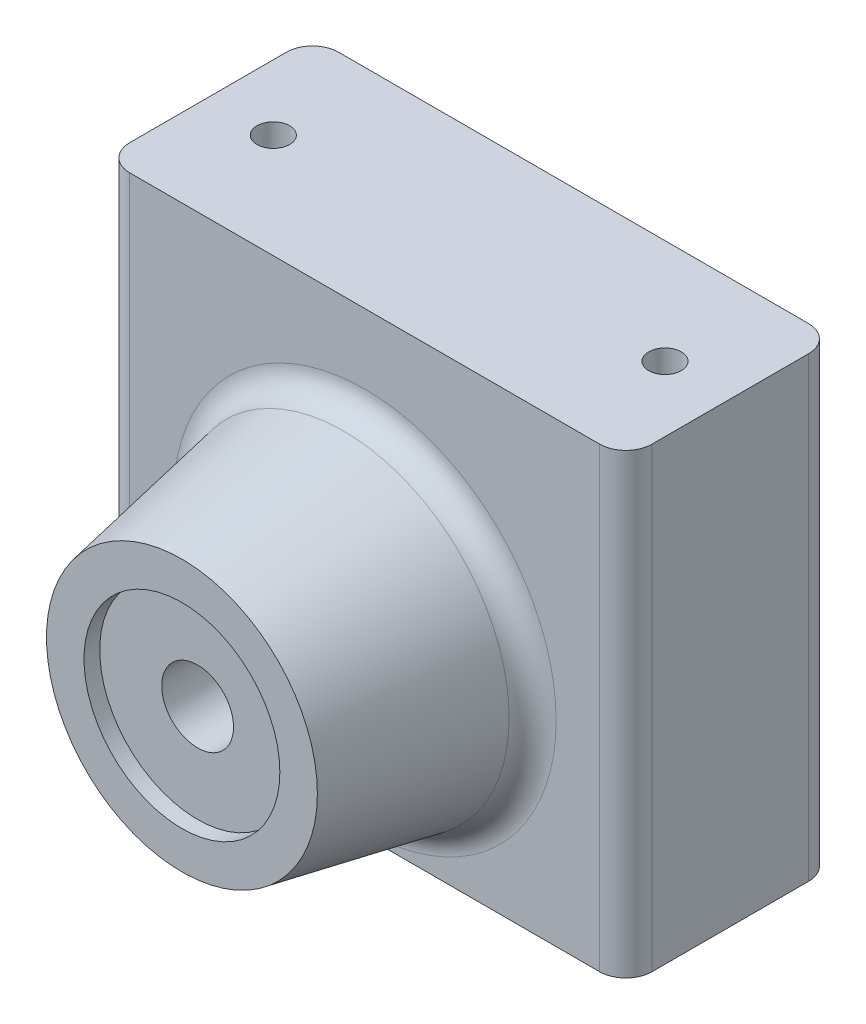
ISO-10303-21;
HEADER;
FILE_DESCRIPTION(('STEP AP214'),'2;1');
FILE_NAME('part.step','',(''),(''),'','','');
FILE_SCHEMA(('AUTOMOTIVE_DESIGN { 1 0 10303 214 1 1 1 1 }'));
ENDSEC;
DATA;
#1=APPLICATION_CONTEXT('core data for automotive mechanical design processes');
#2=APPLICATION_PROTOCOL_DEFINITION('international standard','automotive_design',2000,#1);
#3=PRODUCT_CONTEXT('',#1,'mechanical');
#4=PRODUCT('Part','Part','',(#3));
#5=PRODUCT_RELATED_PRODUCT_CATEGORY('part','',(#4));
#6=PRODUCT_DEFINITION_FORMATION('','',#4);
#7=PRODUCT_DEFINITION_CONTEXT('part definition',#1,'design');
#8=PRODUCT_DEFINITION('design','',#6,#7);
#9=PRODUCT_DEFINITION_SHAPE('','',#8);
#10=(LENGTH_UNIT() NAMED_UNIT(*) SI_UNIT(.MILLI.,.METRE.));
#11=(NAMED_UNIT(*) PLANE_ANGLE_UNIT() SI_UNIT($,.RADIAN.));
#12=(NAMED_UNIT(*) SI_UNIT($,.STERADIAN.) SOLID_ANGLE_UNIT());
#13=UNCERTAINTY_MEASURE_WITH_UNIT(LENGTH_MEASURE(1.E-05),#10,'distance_accuracy_value','');
#14=(GEOMETRIC_REPRESENTATION_CONTEXT(3) GLOBAL_UNCERTAINTY_ASSIGNED_CONTEXT((#13)) GLOBAL_UNIT_ASSIGNED_CONTEXT((#10,
#11,#12)) REPRESENTATION_CONTEXT('',''));
#15=CARTESIAN_POINT('',(0.,0.,0.));
#16=DIRECTION('',(0.,0.,1.));
#17=DIRECTION('',(1.,0.,0.));
#18=AXIS2_PLACEMENT_3D('',#15,#16,#17);
#19=CARTESIAN_POINT('',(0.,0.,-16.));
#20=DIRECTION('',(0.,0.,1.));
#21=DIRECTION('',(1.,0.,0.));
#22=AXIS2_PLACEMENT_3D('',#19,#20,#21);
#23=CYLINDRICAL_SURFACE('',#22,2.75);
#24=CARTESIAN_POINT('',(0.,0.,12.8));
#25=DIRECTION('',(0.,0.,1.));
#26=DIRECTION('',(1.,0.,0.));
#27=AXIS2_PLACEMENT_3D('',#24,#25,#26);
#28=CIRCLE('',#27,2.75);
#29=CARTESIAN_POINT('',(2.75,0.,12.8));
#30=VERTEX_POINT('',#29);
#31=EDGE_CURVE('E161',#30,#30,#28,.F.);
#32=ORIENTED_EDGE('',*,*,#31,.F.);
#33=EDGE_LOOP('',(#32));
#34=FACE_BOUND('',#33,.T.);
#35=CARTESIAN_POINT('',(0.,0.,-14.5));
#36=DIRECTION('',(0.,0.,-1.));
#37=DIRECTION('',(-1.,0.,0.));
#38=AXIS2_PLACEMENT_3D('',#35,#36,#37);
#39=CIRCLE('',#38,2.75);
#40=CARTESIAN_POINT('',(-2.75,0.,-14.5));
#41=VERTEX_POINT('',#40);
#42=EDGE_CURVE('E47',#41,#41,#39,.F.);
#43=ORIENTED_EDGE('',*,*,#42,.F.);
#44=EDGE_LOOP('',(#43));
#45=FACE_BOUND('',#44,.T.);
#46=ADVANCED_FACE('F43',(#34,#45),#23,.F.);
#47=CARTESIAN_POINT('',(-20.,20.,-16.));
#48=DIRECTION('',(-1.,0.,0.));
#49=DIRECTION('',(0.,-1.,0.));
#50=AXIS2_PLACEMENT_3D('',#47,#48,#49);
#51=PLANE('',#50);
#52=DIRECTION('',(0.,0.,1.));
#53=VECTOR('',#52,1.);
#54=CARTESIAN_POINT('',(-20.,20.,-16.));
#55=LINE('',#54,#53);
#56=CARTESIAN_POINT('',(-20.,20.,-14.));
#57=VERTEX_POINT('',#56);
#58=CARTESIAN_POINT('',(-20.,20.,-2.));
#59=VERTEX_POINT('',#58);
#60=EDGE_CURVE('E199',#57,#59,#55,.T.);
#61=ORIENTED_EDGE('',*,*,#60,.F.);
#62=DIRECTION('',(0.,-1.,0.));
#63=VECTOR('',#62,1.);
#64=CARTESIAN_POINT('',(-20.,-15.,-14.));
#65=LINE('',#64,#63);
#66=CARTESIAN_POINT('',(-20.,-15.,-14.));
#67=VERTEX_POINT('',#66);
#68=EDGE_CURVE('E11',#57,#67,#65,.T.);
#69=ORIENTED_EDGE('',*,*,#68,.T.);
#70=DIRECTION('',(0.,0.,1.));
#71=VECTOR('',#70,1.);
#72=CARTESIAN_POINT('',(-20.,-15.,-16.));
#73=LINE('',#72,#71);
#74=CARTESIAN_POINT('',(-20.,-15.,-2.));
#75=VERTEX_POINT('',#74);
#76=EDGE_CURVE('E133',#67,#75,#73,.T.);
#77=ORIENTED_EDGE('',*,*,#76,.T.);
#78=DIRECTION('',(0.,-1.,0.));
#79=VECTOR('',#78,1.);
#80=CARTESIAN_POINT('',(-20.,20.,-2.));
#81=LINE('',#80,#79);
#82=EDGE_CURVE('E52',#75,#59,#81,.F.);
#83=ORIENTED_EDGE('',*,*,#82,.T.);
#84=EDGE_LOOP('',(#61,#69,#77,#83));
#85=FACE_BOUND('',#84,.T.);
#86=ADVANCED_FACE('F240',(#85),#51,.T.);
#87=CARTESIAN_POINT('',(-20.,20.,-16.));
#88=DIRECTION('',(0.,1.,0.));
#89=DIRECTION('',(-1.,0.,0.));
#90=AXIS2_PLACEMENT_3D('',#87,#88,#89);
#91=PLANE('',#90);
#92=CARTESIAN_POINT('',(15.,20.,-8.));
#93=DIRECTION('',(0.,1.,0.));
#94=DIRECTION('',(-1.,0.,0.));
#95=AXIS2_PLACEMENT_3D('',#92,#93,#94);
#96=CIRCLE('',#95,1.25);
#97=CARTESIAN_POINT('',(13.75,20.,-8.));
#98=VERTEX_POINT('',#97);
#99=EDGE_CURVE('E163',#98,#98,#96,.T.);
#100=ORIENTED_EDGE('',*,*,#99,.F.);
#101=EDGE_LOOP('',(#100));
#102=FACE_BOUND('',#101,.T.);
#103=CARTESIAN_POINT('',(-15.,20.,-8.));
#104=DIRECTION('',(0.,1.,0.));
#105=DIRECTION('',(-1.,0.,0.));
#106=AXIS2_PLACEMENT_3D('',#103,#104,#105);
#107=CIRCLE('',#106,1.25);
#108=CARTESIAN_POINT('',(-16.25,20.,-8.));
#109=VERTEX_POINT('',#108);
#110=EDGE_CURVE('E182',#109,#109,#107,.T.);
#111=ORIENTED_EDGE('',*,*,#110,.F.);
#112=EDGE_LOOP('',(#111));
#113=FACE_BOUND('',#112,.T.);
#114=DIRECTION('',(0.,0.,1.));
#115=VECTOR('',#114,1.);
#116=CARTESIAN_POINT('',(20.,20.,-16.));
#117=LINE('',#116,#115);
#118=CARTESIAN_POINT('',(20.,20.,-14.));
#119=VERTEX_POINT('',#118);
#120=CARTESIAN_POINT('',(20.,20.,-2.));
#121=VERTEX_POINT('',#120);
#122=EDGE_CURVE('E132',#119,#121,#117,.T.);
#123=ORIENTED_EDGE('',*,*,#122,.F.);
#124=CARTESIAN_POINT('',(18.,20.,-14.));
#125=DIRECTION('',(0.,1.,0.));
#126=DIRECTION('',(-1.,0.,0.));
#127=AXIS2_PLACEMENT_3D('',#124,#125,#126);
#128=CIRCLE('',#127,2.);
#129=CARTESIAN_POINT('',(18.,20.,-16.));
#130=VERTEX_POINT('',#129);
#131=EDGE_CURVE('E136',#119,#130,#128,.T.);
#132=ORIENTED_EDGE('',*,*,#131,.T.);
#133=DIRECTION('',(-1.,0.,0.));
#134=VECTOR('',#133,1.);
#135=CARTESIAN_POINT('',(-20.,20.,-16.));
#136=LINE('',#135,#134);
#137=CARTESIAN_POINT('',(-18.,20.,-16.));
#138=VERTEX_POINT('',#137);
#139=EDGE_CURVE('E191',#130,#138,#136,.T.);
#140=ORIENTED_EDGE('',*,*,#139,.T.);
#141=CARTESIAN_POINT('',(-18.,20.,-14.));
#142=DIRECTION('',(0.,1.,0.));
#143=DIRECTION('',(-1.,0.,0.));
#144=AXIS2_PLACEMENT_3D('',#141,#142,#143);
#145=CIRCLE('',#144,2.);
#146=EDGE_CURVE('E139',#138,#57,#145,.T.);
#147=ORIENTED_EDGE('',*,*,#146,.T.);
#148=ORIENTED_EDGE('',*,*,#60,.T.);
#149=CARTESIAN_POINT('',(-18.,20.,-2.));
#150=DIRECTION('',(0.,1.,0.));
#151=DIRECTION('',(-1.,0.,0.));
#152=AXIS2_PLACEMENT_3D('',#149,#150,#151);
#153=CIRCLE('',#152,2.);
#154=CARTESIAN_POINT('',(-18.,20.,0.));
#155=VERTEX_POINT('',#154);
#156=EDGE_CURVE('E137',#59,#155,#153,.T.);
#157=ORIENTED_EDGE('',*,*,#156,.T.);
#158=DIRECTION('',(-1.,0.,0.));
#159=VECTOR('',#158,1.);
#160=CARTESIAN_POINT('',(-20.,20.,0.));
#161=LINE('',#160,#159);
#162=CARTESIAN_POINT('',(18.,20.,0.));
#163=VERTEX_POINT('',#162);
#164=EDGE_CURVE('E192',#163,#155,#161,.T.);
#165=ORIENTED_EDGE('',*,*,#164,.F.);
#166=CARTESIAN_POINT('',(18.,20.,-2.));
#167=DIRECTION('',(0.,1.,0.));
#168=DIRECTION('',(-1.,0.,0.));
#169=AXIS2_PLACEMENT_3D('',#166,#167,#168);
#170=CIRCLE('',#169,2.);
#171=EDGE_CURVE('E146',#163,#121,#170,.T.);
#172=ORIENTED_EDGE('',*,*,#171,.T.);
#173=EDGE_LOOP('',(#123,#132,#140,#147,#148,#157,#165,#172));
#174=FACE_BOUND('',#173,.T.);
#175=ADVANCED_FACE('F234',(#102,#113,#174),#91,.T.);
#176=CARTESIAN_POINT('',(20.,20.,-16.));
#177=DIRECTION('',(1.,0.,0.));
#178=DIRECTION('',(0.,1.,0.));
#179=AXIS2_PLACEMENT_3D('',#176,#177,#178);
#180=PLANE('',#179);
#181=DIRECTION('',(0.,0.,1.));
#182=VECTOR('',#181,1.);
#183=CARTESIAN_POINT('',(20.,-15.,-16.));
#184=LINE('',#183,#182);
#185=CARTESIAN_POINT('',(20.,-15.,-14.));
#186=VERTEX_POINT('',#185);
#187=CARTESIAN_POINT('',(20.,-15.,-2.));
#188=VERTEX_POINT('',#187);
#189=EDGE_CURVE('E114',#186,#188,#184,.T.);
#190=ORIENTED_EDGE('',*,*,#189,.F.);
#191=DIRECTION('',(0.,1.,0.));
#192=VECTOR('',#191,1.);
#193=CARTESIAN_POINT('',(20.,20.,-14.));
#194=LINE('',#193,#192);
#195=EDGE_CURVE('E128',#186,#119,#194,.T.);
#196=ORIENTED_EDGE('',*,*,#195,.T.);
#197=ORIENTED_EDGE('',*,*,#122,.T.);
#198=DIRECTION('',(0.,1.,0.));
#199=VECTOR('',#198,1.);
#200=CARTESIAN_POINT('',(20.,20.,-2.));
#201=LINE('',#200,#199);
#202=EDGE_CURVE('E131',#121,#188,#201,.F.);
#203=ORIENTED_EDGE('',*,*,#202,.T.);
#204=EDGE_LOOP('',(#190,#196,#197,#203));
#205=FACE_BOUND('',#204,.T.);
#206=ADVANCED_FACE('F126',(#205),#180,.T.);
#207=CARTESIAN_POINT('',(-20.,-15.,-16.));
#208=DIRECTION('',(0.,-1.,0.));
#209=DIRECTION('',(1.,0.,0.));
#210=AXIS2_PLACEMENT_3D('',#207,#208,#209);
#211=PLANE('',#210);
#212=CARTESIAN_POINT('',(15.,-15.,-8.));
#213=DIRECTION('',(0.,1.,0.));
#214=DIRECTION('',(-1.,0.,0.));
#215=AXIS2_PLACEMENT_3D('',#212,#213,#214);
#216=CIRCLE('',#215,1.25);
#217=CARTESIAN_POINT('',(13.75,-15.,-8.));
#218=VERTEX_POINT('',#217);
#219=EDGE_CURVE('E168',#218,#218,#216,.T.);
#220=ORIENTED_EDGE('',*,*,#219,.T.);
#221=EDGE_LOOP('',(#220));
#222=FACE_BOUND('',#221,.T.);
#223=CARTESIAN_POINT('',(-15.,-15.,-8.));
#224=DIRECTION('',(0.,1.,0.));
#225=DIRECTION('',(-1.,0.,0.));
#226=AXIS2_PLACEMENT_3D('',#223,#224,#225);
#227=CIRCLE('',#226,1.25);
#228=CARTESIAN_POINT('',(-16.25,-15.,-8.));
#229=VERTEX_POINT('',#228);
#230=EDGE_CURVE('E184',#229,#229,#227,.T.);
#231=ORIENTED_EDGE('',*,*,#230,.T.);
#232=EDGE_LOOP('',(#231));
#233=FACE_BOUND('',#232,.T.);
#234=DIRECTION('',(1.,0.,0.));
#235=VECTOR('',#234,1.);
#236=CARTESIAN_POINT('',(-20.,-15.,-16.));
#237=LINE('',#236,#235);
#238=CARTESIAN_POINT('',(-18.,-15.,-16.));
#239=VERTEX_POINT('',#238);
#240=CARTESIAN_POINT('',(18.,-15.,-16.));
#241=VERTEX_POINT('',#240);
#242=EDGE_CURVE('E117',#239,#241,#237,.T.);
#243=ORIENTED_EDGE('',*,*,#242,.T.);
#244=CARTESIAN_POINT('',(18.,-15.,-14.));
#245=DIRECTION('',(0.,-1.,0.));
#246=DIRECTION('',(1.,0.,0.));
#247=AXIS2_PLACEMENT_3D('',#244,#245,#246);
#248=CIRCLE('',#247,2.);
#249=EDGE_CURVE('E111',#241,#186,#248,.T.);
#250=ORIENTED_EDGE('',*,*,#249,.T.);
#251=ORIENTED_EDGE('',*,*,#189,.T.);
#252=CARTESIAN_POINT('',(18.,-15.,-2.));
#253=DIRECTION('',(0.,-1.,0.));
#254=DIRECTION('',(1.,0.,0.));
#255=AXIS2_PLACEMENT_3D('',#252,#253,#254);
#256=CIRCLE('',#255,2.);
#257=CARTESIAN_POINT('',(18.,-15.,0.));
#258=VERTEX_POINT('',#257);
#259=EDGE_CURVE('E122',#188,#258,#256,.T.);
#260=ORIENTED_EDGE('',*,*,#259,.T.);
#261=DIRECTION('',(1.,0.,0.));
#262=VECTOR('',#261,1.);
#263=CARTESIAN_POINT('',(-20.,-15.,0.));
#264=LINE('',#263,#262);
#265=CARTESIAN_POINT('',(-18.,-15.,0.));
#266=VERTEX_POINT('',#265);
#267=EDGE_CURVE('E187',#266,#258,#264,.T.);
#268=ORIENTED_EDGE('',*,*,#267,.F.);
#269=CARTESIAN_POINT('',(-18.,-15.,-2.));
#270=DIRECTION('',(0.,-1.,0.));
#271=DIRECTION('',(1.,0.,0.));
#272=AXIS2_PLACEMENT_3D('',#269,#270,#271);
#273=CIRCLE('',#272,2.);
#274=EDGE_CURVE('E60',#266,#75,#273,.T.);
#275=ORIENTED_EDGE('',*,*,#274,.T.);
#276=ORIENTED_EDGE('',*,*,#76,.F.);
#277=CARTESIAN_POINT('',(-18.,-15.,-14.));
#278=DIRECTION('',(0.,-1.,0.));
#279=DIRECTION('',(1.,0.,0.));
#280=AXIS2_PLACEMENT_3D('',#277,#278,#279);
#281=CIRCLE('',#280,2.);
#282=EDGE_CURVE('E68',#67,#239,#281,.T.);
#283=ORIENTED_EDGE('',*,*,#282,.T.);
#284=EDGE_LOOP('',(#243,#250,#251,#260,#268,#275,#276,#283));
#285=FACE_BOUND('',#284,.T.);
#286=ADVANCED_FACE('F113',(#222,#233,#285),#211,.T.);
#287=CARTESIAN_POINT('',(0.,0.,-16.));
#288=DIRECTION('',(0.,0.,1.));
#289=DIRECTION('',(1.,0.,0.));
#290=AXIS2_PLACEMENT_3D('',#287,#288,#289);
#291=PLANE('',#290);
#292=CARTESIAN_POINT('',(0.,0.,-16.));
#293=DIRECTION('',(0.,0.,-1.));
#294=DIRECTION('',(-1.,0.,0.));
#295=AXIS2_PLACEMENT_3D('',#292,#293,#294);
#296=CIRCLE('',#295,7.5);
#297=CARTESIAN_POINT('',(-7.5,0.,-16.));
#298=VERTEX_POINT('',#297);
#299=EDGE_CURVE('E178',#298,#298,#296,.T.);
#300=ORIENTED_EDGE('',*,*,#299,.F.);
#301=EDGE_LOOP('',(#300));
#302=FACE_BOUND('',#301,.T.);
#303=ORIENTED_EDGE('',*,*,#139,.F.);
#304=DIRECTION('',(0.,1.,0.));
#305=VECTOR('',#304,1.);
#306=CARTESIAN_POINT('',(18.,-15.,-16.));
#307=LINE('',#306,#305);
#308=EDGE_CURVE('E151',#130,#241,#307,.F.);
#309=ORIENTED_EDGE('',*,*,#308,.T.);
#310=ORIENTED_EDGE('',*,*,#242,.F.);
#311=DIRECTION('',(0.,-1.,0.));
#312=VECTOR('',#311,1.);
#313=CARTESIAN_POINT('',(-18.,20.,-16.));
#314=LINE('',#313,#312);
#315=EDGE_CURVE('E149',#239,#138,#314,.F.);
#316=ORIENTED_EDGE('',*,*,#315,.T.);
#317=EDGE_LOOP('',(#303,#309,#310,#316));
#318=FACE_BOUND('',#317,.T.);
#319=ADVANCED_FACE('F226',(#302,#318),#291,.F.);
#320=CARTESIAN_POINT('',(0.,0.,0.));
#321=DIRECTION('',(0.,0.,1.));
#322=DIRECTION('',(1.,0.,0.));
#323=AXIS2_PLACEMENT_3D('',#320,#321,#322);
#324=PLANE('',#323);
#325=CARTESIAN_POINT('',(0.,0.,0.));
#326=DIRECTION('',(0.,0.,1.));
#327=DIRECTION('',(1.,0.,0.));
#328=AXIS2_PLACEMENT_3D('',#325,#326,#327);
#329=CIRCLE('',#328,14.6598525745125);
#330=CARTESIAN_POINT('',(14.6598525745125,0.,0.));
#331=VERTEX_POINT('',#330);
#332=EDGE_CURVE('E207',#331,#331,#329,.F.);
#333=ORIENTED_EDGE('',*,*,#332,.T.);
#334=EDGE_LOOP('',(#333));
#335=FACE_BOUND('',#334,.T.);
#336=ORIENTED_EDGE('',*,*,#267,.T.);
#337=DIRECTION('',(0.,1.,0.));
#338=VECTOR('',#337,1.);
#339=CARTESIAN_POINT('',(18.,0.,0.));
#340=LINE('',#339,#338);
#341=EDGE_CURVE('E158',#258,#163,#340,.T.);
#342=ORIENTED_EDGE('',*,*,#341,.T.);
#343=ORIENTED_EDGE('',*,*,#164,.T.);
#344=DIRECTION('',(0.,-1.,0.));
#345=VECTOR('',#344,1.);
#346=CARTESIAN_POINT('',(-18.,0.,0.));
#347=LINE('',#346,#345);
#348=EDGE_CURVE('E121',#155,#266,#347,.T.);
#349=ORIENTED_EDGE('',*,*,#348,.T.);
#350=EDGE_LOOP('',(#336,#342,#343,#349));
#351=FACE_BOUND('',#350,.T.);
#352=ADVANCED_FACE('F222',(#335,#351),#324,.T.);
#353=CARTESIAN_POINT('',(0.,0.,14.));
#354=DIRECTION('',(0.,0.,1.));
#355=DIRECTION('',(1.,0.,0.));
#356=AXIS2_PLACEMENT_3D('',#353,#354,#355);
#357=PLANE('',#356);
#358=CARTESIAN_POINT('',(0.,0.,14.));
#359=DIRECTION('',(0.,0.,1.));
#360=DIRECTION('',(1.,0.,0.));
#361=AXIS2_PLACEMENT_3D('',#358,#359,#360);
#362=CIRCLE('',#361,7.5);
#363=CARTESIAN_POINT('',(7.5,0.,14.));
#364=VERTEX_POINT('',#363);
#365=EDGE_CURVE('E171',#364,#364,#362,.T.);
#366=ORIENTED_EDGE('',*,*,#365,.F.);
#367=EDGE_LOOP('',(#366));
#368=FACE_BOUND('',#367,.T.);
#369=CARTESIAN_POINT('',(0.,0.,14.));
#370=DIRECTION('',(0.,0.,1.));
#371=DIRECTION('',(1.,0.,0.));
#372=AXIS2_PLACEMENT_3D('',#369,#370,#371);
#373=CIRCLE('',#372,10.375);
#374=CARTESIAN_POINT('',(10.375,0.,14.));
#375=VERTEX_POINT('',#374);
#376=EDGE_CURVE('E202',#375,#375,#373,.T.);
#377=ORIENTED_EDGE('',*,*,#376,.T.);
#378=EDGE_LOOP('',(#377));
#379=FACE_BOUND('',#378,.T.);
#380=ADVANCED_FACE('F225',(#368,#379),#357,.T.);
#381=CARTESIAN_POINT('',(0.,0.,16.));
#382=DIRECTION('',(0.,0.,-1.));
#383=DIRECTION('',(-1.,0.,0.));
#384=AXIS2_PLACEMENT_3D('',#381,#382,#383);
#385=CONICAL_SURFACE('',#384,10.,0.185347949995695);
#386=CARTESIAN_POINT('',(0.,0.,1.63142292989964));
#387=DIRECTION('',(0.,0.,1.));
#388=DIRECTION('',(1.,0.,0.));
#389=AXIS2_PLACEMENT_3D('',#386,#387,#388);
#390=CIRCLE('',#389,12.6941082006438);
#391=CARTESIAN_POINT('',(12.6941082006438,0.,1.63142292989964));
#392=VERTEX_POINT('',#391);
#393=EDGE_CURVE('E141',#392,#392,#390,.T.);
#394=ORIENTED_EDGE('',*,*,#393,.T.);
#395=EDGE_LOOP('',(#394));
#396=FACE_BOUND('',#395,.T.);
#397=ORIENTED_EDGE('',*,*,#376,.F.);
#398=EDGE_LOOP('',(#397));
#399=FACE_BOUND('',#398,.T.);
#400=ADVANCED_FACE('F212',(#396,#399),#385,.T.);
#401=CARTESIAN_POINT('',(0.,0.,2.));
#402=DIRECTION('',(0.,0.,1.));
#403=DIRECTION('',(1.,0.,0.));
#404=AXIS2_PLACEMENT_3D('',#401,#402,#403);
#405=TOROIDAL_SURFACE('',#404,14.6598525745125,2.);
#406=ORIENTED_EDGE('',*,*,#393,.F.);
#407=EDGE_LOOP('',(#406));
#408=FACE_BOUND('',#407,.T.);
#409=ORIENTED_EDGE('',*,*,#332,.F.);
#410=EDGE_LOOP('',(#409));
#411=FACE_BOUND('',#410,.T.);
#412=ADVANCED_FACE('F215',(#408,#411),#405,.F.);
#413=CARTESIAN_POINT('',(-15.,-15.,-8.));
#414=DIRECTION('',(0.,1.,0.));
#415=DIRECTION('',(-1.,0.,0.));
#416=AXIS2_PLACEMENT_3D('',#413,#414,#415);
#417=CYLINDRICAL_SURFACE('',#416,1.25);
#418=ORIENTED_EDGE('',*,*,#230,.F.);
#419=EDGE_LOOP('',(#418));
#420=FACE_BOUND('',#419,.T.);
#421=ORIENTED_EDGE('',*,*,#110,.T.);
#422=EDGE_LOOP('',(#421));
#423=FACE_BOUND('',#422,.T.);
#424=ADVANCED_FACE('F218',(#420,#423),#417,.F.);
#425=CARTESIAN_POINT('',(15.,-15.,-8.));
#426=DIRECTION('',(0.,1.,0.));
#427=DIRECTION('',(-1.,0.,0.));
#428=AXIS2_PLACEMENT_3D('',#425,#426,#427);
#429=CYLINDRICAL_SURFACE('',#428,1.25);
#430=ORIENTED_EDGE('',*,*,#219,.F.);
#431=EDGE_LOOP('',(#430));
#432=FACE_BOUND('',#431,.T.);
#433=ORIENTED_EDGE('',*,*,#99,.T.);
#434=EDGE_LOOP('',(#433));
#435=FACE_BOUND('',#434,.T.);
#436=ADVANCED_FACE('F290',(#432,#435),#429,.F.);
#437=CARTESIAN_POINT('',(18.,20.,-14.));
#438=DIRECTION('',(0.,-1.,0.));
#439=DIRECTION('',(1.,0.,0.));
#440=AXIS2_PLACEMENT_3D('',#437,#438,#439);
#441=CYLINDRICAL_SURFACE('',#440,2.);
#442=ORIENTED_EDGE('',*,*,#249,.F.);
#443=ORIENTED_EDGE('',*,*,#308,.F.);
#444=ORIENTED_EDGE('',*,*,#131,.F.);
#445=ORIENTED_EDGE('',*,*,#195,.F.);
#446=EDGE_LOOP('',(#442,#443,#444,#445));
#447=FACE_BOUND('',#446,.T.);
#448=ADVANCED_FACE('F135',(#447),#441,.T.);
#449=CARTESIAN_POINT('',(18.,0.,-2.));
#450=DIRECTION('',(0.,1.,0.));
#451=DIRECTION('',(-1.,0.,0.));
#452=AXIS2_PLACEMENT_3D('',#449,#450,#451);
#453=CYLINDRICAL_SURFACE('',#452,2.);
#454=ORIENTED_EDGE('',*,*,#259,.F.);
#455=ORIENTED_EDGE('',*,*,#202,.F.);
#456=ORIENTED_EDGE('',*,*,#171,.F.);
#457=ORIENTED_EDGE('',*,*,#341,.F.);
#458=EDGE_LOOP('',(#454,#455,#456,#457));
#459=FACE_BOUND('',#458,.T.);
#460=ADVANCED_FACE('F232',(#459),#453,.T.);
#461=CARTESIAN_POINT('',(-18.,20.,-14.));
#462=DIRECTION('',(0.,1.,0.));
#463=DIRECTION('',(-1.,0.,0.));
#464=AXIS2_PLACEMENT_3D('',#461,#462,#463);
#465=CYLINDRICAL_SURFACE('',#464,2.);
#466=ORIENTED_EDGE('',*,*,#146,.F.);
#467=ORIENTED_EDGE('',*,*,#315,.F.);
#468=ORIENTED_EDGE('',*,*,#282,.F.);
#469=ORIENTED_EDGE('',*,*,#68,.F.);
#470=EDGE_LOOP('',(#466,#467,#468,#469));
#471=FACE_BOUND('',#470,.T.);
#472=ADVANCED_FACE('F243',(#471),#465,.T.);
#473=CARTESIAN_POINT('',(-18.,0.,-2.));
#474=DIRECTION('',(0.,-1.,0.));
#475=DIRECTION('',(1.,0.,0.));
#476=AXIS2_PLACEMENT_3D('',#473,#474,#475);
#477=CYLINDRICAL_SURFACE('',#476,2.);
#478=ORIENTED_EDGE('',*,*,#156,.F.);
#479=ORIENTED_EDGE('',*,*,#82,.F.);
#480=ORIENTED_EDGE('',*,*,#274,.F.);
#481=ORIENTED_EDGE('',*,*,#348,.F.);
#482=EDGE_LOOP('',(#478,#479,#480,#481));
#483=FACE_BOUND('',#482,.T.);
#484=ADVANCED_FACE('F45',(#483),#477,.T.);
#485=CARTESIAN_POINT('',(0.,0.,12.8));
#486=DIRECTION('',(0.,0.,1.));
#487=DIRECTION('',(1.,0.,0.));
#488=AXIS2_PLACEMENT_3D('',#485,#486,#487);
#489=PLANE('',#488);
#490=CARTESIAN_POINT('',(0.,0.,12.8));
#491=DIRECTION('',(0.,0.,1.));
#492=DIRECTION('',(1.,0.,0.));
#493=AXIS2_PLACEMENT_3D('',#490,#491,#492);
#494=CIRCLE('',#493,7.5);
#495=CARTESIAN_POINT('',(7.5,0.,12.8));
#496=VERTEX_POINT('',#495);
#497=EDGE_CURVE('E164',#496,#496,#494,.T.);
#498=ORIENTED_EDGE('',*,*,#497,.T.);
#499=EDGE_LOOP('',(#498));
#500=FACE_BOUND('',#499,.T.);
#501=ORIENTED_EDGE('',*,*,#31,.T.);
#502=EDGE_LOOP('',(#501));
#503=FACE_BOUND('',#502,.T.);
#504=ADVANCED_FACE('F278',(#500,#503),#489,.T.);
#505=CARTESIAN_POINT('',(0.,0.,12.8));
#506=DIRECTION('',(0.,0.,1.));
#507=DIRECTION('',(1.,0.,0.));
#508=AXIS2_PLACEMENT_3D('',#505,#506,#507);
#509=CYLINDRICAL_SURFACE('',#508,7.5);
#510=ORIENTED_EDGE('',*,*,#497,.F.);
#511=EDGE_LOOP('',(#510));
#512=FACE_BOUND('',#511,.T.);
#513=ORIENTED_EDGE('',*,*,#365,.T.);
#514=EDGE_LOOP('',(#513));
#515=FACE_BOUND('',#514,.T.);
#516=ADVANCED_FACE('F275',(#512,#515),#509,.F.);
#517=CARTESIAN_POINT('',(0.,0.,-14.5));
#518=DIRECTION('',(0.,0.,-1.));
#519=DIRECTION('',(-1.,0.,0.));
#520=AXIS2_PLACEMENT_3D('',#517,#518,#519);
#521=PLANE('',#520);
#522=CARTESIAN_POINT('',(0.,0.,-14.5));
#523=DIRECTION('',(0.,0.,-1.));
#524=DIRECTION('',(-1.,0.,0.));
#525=AXIS2_PLACEMENT_3D('',#522,#523,#524);
#526=CIRCLE('',#525,7.5);
#527=CARTESIAN_POINT('',(-7.5,0.,-14.5));
#528=VERTEX_POINT('',#527);
#529=EDGE_CURVE('E361',#528,#528,#526,.T.);
#530=ORIENTED_EDGE('',*,*,#529,.T.);
#531=EDGE_LOOP('',(#530));
#532=FACE_BOUND('',#531,.T.);
#533=ORIENTED_EDGE('',*,*,#42,.T.);
#534=EDGE_LOOP('',(#533));
#535=FACE_BOUND('',#534,.T.);
#536=ADVANCED_FACE('F277',(#532,#535),#521,.T.);
#537=CARTESIAN_POINT('',(0.,0.,-14.5));
#538=DIRECTION('',(0.,0.,-1.));
#539=DIRECTION('',(-1.,0.,0.));
#540=AXIS2_PLACEMENT_3D('',#537,#538,#539);
#541=CYLINDRICAL_SURFACE('',#540,7.5);
#542=ORIENTED_EDGE('',*,*,#529,.F.);
#543=EDGE_LOOP('',(#542));
#544=FACE_BOUND('',#543,.T.);
#545=ORIENTED_EDGE('',*,*,#299,.T.);
#546=EDGE_LOOP('',(#545));
#547=FACE_BOUND('',#546,.T.);
#548=ADVANCED_FACE('F285',(#544,#547),#541,.F.);
#549=CLOSED_SHELL('',(#46,#86,#175,#206,#286,#319,#352,#380,#400,#412,#424,#436,#448,#460,#472,
#484,#504,#516,#536,#548));
#550=MANIFOLD_SOLID_BREP('B2',#549);
#551=ADVANCED_BREP_SHAPE_REPRESENTATION('',(#18,#550),#14);
#552=SHAPE_DEFINITION_REPRESENTATION(#9,#551);
ENDSEC;
END-ISO-10303-21;
